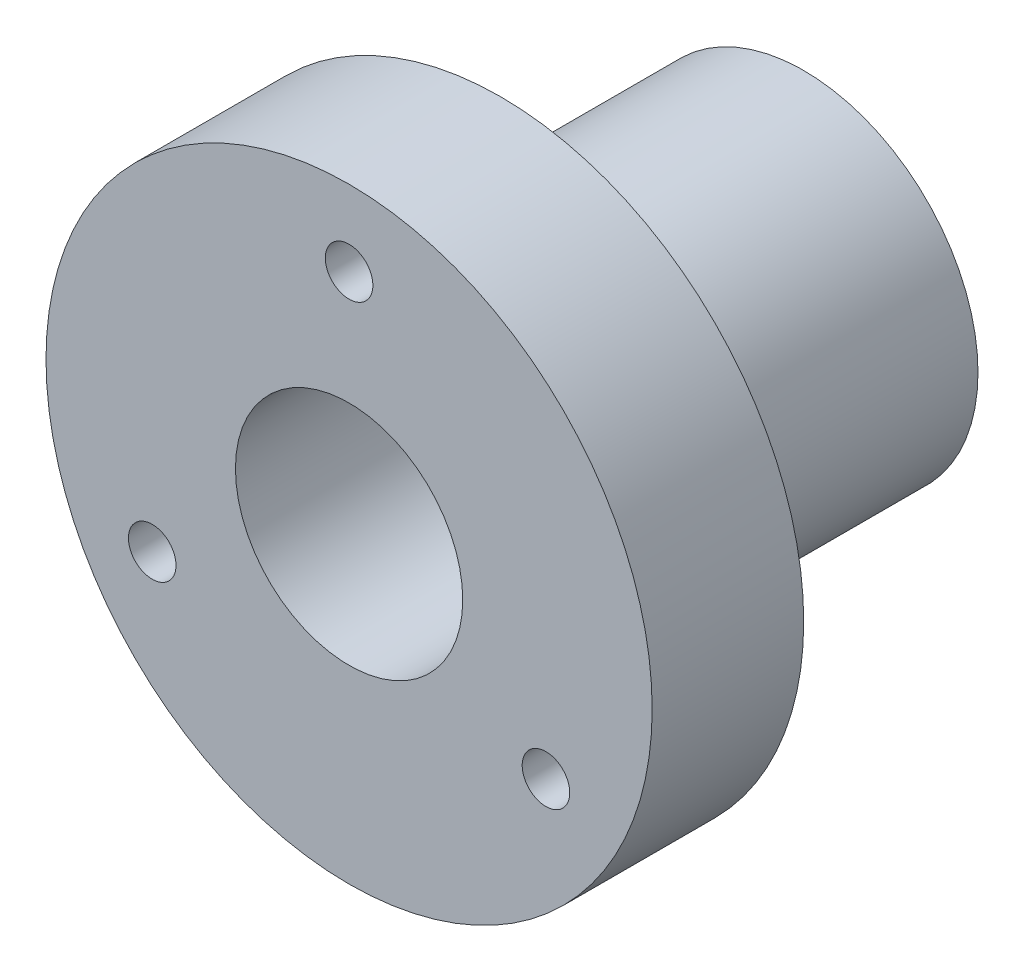
ISO-10303-21;
HEADER;
FILE_DESCRIPTION(('STEP AP214'),'2;1');
FILE_NAME('part.step','',(''),(''),'','','');
FILE_SCHEMA(('AUTOMOTIVE_DESIGN { 1 0 10303 214 1 1 1 1 }'));
ENDSEC;
DATA;
#1=APPLICATION_CONTEXT('core data for automotive mechanical design processes');
#2=APPLICATION_PROTOCOL_DEFINITION('international standard','automotive_design',2000,#1);
#3=PRODUCT_CONTEXT('',#1,'mechanical');
#4=PRODUCT('Part','Part','',(#3));
#5=PRODUCT_RELATED_PRODUCT_CATEGORY('part','',(#4));
#6=PRODUCT_DEFINITION_FORMATION('','',#4);
#7=PRODUCT_DEFINITION_CONTEXT('part definition',#1,'design');
#8=PRODUCT_DEFINITION('design','',#6,#7);
#9=PRODUCT_DEFINITION_SHAPE('','',#8);
#10=(LENGTH_UNIT() NAMED_UNIT(*) SI_UNIT(.MILLI.,.METRE.));
#11=(NAMED_UNIT(*) PLANE_ANGLE_UNIT() SI_UNIT($,.RADIAN.));
#12=(NAMED_UNIT(*) SI_UNIT($,.STERADIAN.) SOLID_ANGLE_UNIT());
#13=UNCERTAINTY_MEASURE_WITH_UNIT(LENGTH_MEASURE(1.E-05),#10,'distance_accuracy_value','');
#14=(GEOMETRIC_REPRESENTATION_CONTEXT(3) GLOBAL_UNCERTAINTY_ASSIGNED_CONTEXT((#13)) GLOBAL_UNIT_ASSIGNED_CONTEXT((#10,
#11,#12)) REPRESENTATION_CONTEXT('',''));
#15=CARTESIAN_POINT('',(0.,0.,0.));
#16=DIRECTION('',(0.,0.,1.));
#17=DIRECTION('',(1.,0.,0.));
#18=AXIS2_PLACEMENT_3D('',#15,#16,#17);
#19=CARTESIAN_POINT('',(0.,0.,-38.1));
#20=DIRECTION('',(0.,0.,1.));
#21=DIRECTION('',(1.,0.,0.));
#22=AXIS2_PLACEMENT_3D('',#19,#20,#21);
#23=PLANE('',#22);
#24=CARTESIAN_POINT('',(0.,0.,-38.1));
#25=DIRECTION('',(0.,0.,1.));
#26=DIRECTION('',(1.,0.,0.));
#27=AXIS2_PLACEMENT_3D('',#24,#25,#26);
#28=CIRCLE('',#27,14.605);
#29=CARTESIAN_POINT('',(14.605,0.,-38.1));
#30=VERTEX_POINT('',#29);
#31=EDGE_CURVE('E84',#30,#30,#28,.T.);
#32=ORIENTED_EDGE('',*,*,#31,.F.);
#33=EDGE_LOOP('',(#32));
#34=FACE_BOUND('',#33,.T.);
#35=CARTESIAN_POINT('',(0.,0.,-38.1));
#36=DIRECTION('',(0.,0.,-1.));
#37=DIRECTION('',(-1.,0.,0.));
#38=AXIS2_PLACEMENT_3D('',#35,#36,#37);
#39=CIRCLE('',#38,4.99999999999999);
#40=CARTESIAN_POINT('',(-4.99999999999999,0.,-38.1));
#41=VERTEX_POINT('',#40);
#42=EDGE_CURVE('E63',#41,#41,#39,.T.);
#43=ORIENTED_EDGE('',*,*,#42,.F.);
#44=EDGE_LOOP('',(#43));
#45=FACE_BOUND('',#44,.T.);
#46=ADVANCED_FACE('F36',(#34,#45),#23,.F.);
#47=CARTESIAN_POINT('',(0.,0.,-12.7));
#48=DIRECTION('',(0.,0.,1.));
#49=DIRECTION('',(1.,0.,0.));
#50=AXIS2_PLACEMENT_3D('',#47,#48,#49);
#51=CYLINDRICAL_SURFACE('',#50,25.4);
#52=CARTESIAN_POINT('',(0.,0.,-12.7));
#53=DIRECTION('',(0.,0.,1.));
#54=DIRECTION('',(1.,0.,0.));
#55=AXIS2_PLACEMENT_3D('',#52,#53,#54);
#56=CIRCLE('',#55,25.4);
#57=CARTESIAN_POINT('',(25.4,0.,-12.7));
#58=VERTEX_POINT('',#57);
#59=EDGE_CURVE('E10',#58,#58,#56,.T.);
#60=ORIENTED_EDGE('',*,*,#59,.T.);
#61=EDGE_LOOP('',(#60));
#62=FACE_BOUND('',#61,.T.);
#63=CARTESIAN_POINT('',(0.,0.,0.));
#64=DIRECTION('',(0.,0.,1.));
#65=DIRECTION('',(1.,0.,0.));
#66=AXIS2_PLACEMENT_3D('',#63,#64,#65);
#67=CIRCLE('',#66,25.4);
#68=CARTESIAN_POINT('',(25.4,0.,0.));
#69=VERTEX_POINT('',#68);
#70=EDGE_CURVE('E44',#69,#69,#67,.T.);
#71=ORIENTED_EDGE('',*,*,#70,.F.);
#72=EDGE_LOOP('',(#71));
#73=FACE_BOUND('',#72,.T.);
#74=ADVANCED_FACE('F38',(#62,#73),#51,.T.);
#75=CARTESIAN_POINT('',(0.,0.,-12.7));
#76=DIRECTION('',(0.,0.,1.));
#77=DIRECTION('',(1.,0.,0.));
#78=AXIS2_PLACEMENT_3D('',#75,#76,#77);
#79=PLANE('',#78);
#80=CARTESIAN_POINT('',(0.,19.05,-12.7));
#81=DIRECTION('',(0.,0.,-1.));
#82=DIRECTION('',(-1.,0.,0.));
#83=AXIS2_PLACEMENT_3D('',#80,#81,#82);
#84=CIRCLE('',#83,1.9939);
#85=CARTESIAN_POINT('',(-1.9939,19.05,-12.7));
#86=VERTEX_POINT('',#85);
#87=EDGE_CURVE('E55',#86,#86,#84,.T.);
#88=ORIENTED_EDGE('',*,*,#87,.F.);
#89=EDGE_LOOP('',(#88));
#90=FACE_BOUND('',#89,.T.);
#91=CARTESIAN_POINT('',(16.4977839420935,-9.52500000000008,-12.7));
#92=DIRECTION('',(0.,0.,-1.));
#93=DIRECTION('',(-1.,0.,0.));
#94=AXIS2_PLACEMENT_3D('',#91,#92,#93);
#95=CIRCLE('',#94,1.9939);
#96=CARTESIAN_POINT('',(14.5038839420935,-9.52500000000008,-12.7));
#97=VERTEX_POINT('',#96);
#98=EDGE_CURVE('E73',#97,#97,#95,.T.);
#99=ORIENTED_EDGE('',*,*,#98,.F.);
#100=EDGE_LOOP('',(#99));
#101=FACE_BOUND('',#100,.T.);
#102=CARTESIAN_POINT('',(-16.4977839420935,-9.52500000000008,-12.7));
#103=DIRECTION('',(0.,0.,-1.));
#104=DIRECTION('',(-1.,0.,0.));
#105=AXIS2_PLACEMENT_3D('',#102,#103,#104);
#106=CIRCLE('',#105,1.9939);
#107=CARTESIAN_POINT('',(-18.4916839420935,-9.52500000000008,-12.7));
#108=VERTEX_POINT('',#107);
#109=EDGE_CURVE('E79',#108,#108,#106,.T.);
#110=ORIENTED_EDGE('',*,*,#109,.F.);
#111=EDGE_LOOP('',(#110));
#112=FACE_BOUND('',#111,.T.);
#113=CARTESIAN_POINT('',(0.,0.,-12.7));
#114=DIRECTION('',(0.,0.,1.));
#115=DIRECTION('',(1.,0.,0.));
#116=AXIS2_PLACEMENT_3D('',#113,#114,#115);
#117=CIRCLE('',#116,14.605);
#118=CARTESIAN_POINT('',(14.605,0.,-12.7));
#119=VERTEX_POINT('',#118);
#120=EDGE_CURVE('E49',#119,#119,#117,.T.);
#121=ORIENTED_EDGE('',*,*,#120,.T.);
#122=EDGE_LOOP('',(#121));
#123=FACE_BOUND('',#122,.T.);
#124=ORIENTED_EDGE('',*,*,#59,.F.);
#125=EDGE_LOOP('',(#124));
#126=FACE_BOUND('',#125,.T.);
#127=ADVANCED_FACE('F91',(#90,#101,#112,#123,#126),#79,.F.);
#128=CARTESIAN_POINT('',(0.,0.,0.));
#129=DIRECTION('',(0.,0.,1.));
#130=DIRECTION('',(1.,0.,0.));
#131=AXIS2_PLACEMENT_3D('',#128,#129,#130);
#132=PLANE('',#131);
#133=CARTESIAN_POINT('',(0.,0.,0.));
#134=DIRECTION('',(0.,0.,1.));
#135=DIRECTION('',(1.,0.,0.));
#136=AXIS2_PLACEMENT_3D('',#133,#134,#135);
#137=CIRCLE('',#136,9.525);
#138=CARTESIAN_POINT('',(9.525,0.,0.));
#139=VERTEX_POINT('',#138);
#140=EDGE_CURVE('E149',#139,#139,#137,.T.);
#141=ORIENTED_EDGE('',*,*,#140,.F.);
#142=EDGE_LOOP('',(#141));
#143=FACE_BOUND('',#142,.T.);
#144=CARTESIAN_POINT('',(0.,19.05,0.));
#145=DIRECTION('',(0.,0.,-1.));
#146=DIRECTION('',(-1.,0.,0.));
#147=AXIS2_PLACEMENT_3D('',#144,#145,#146);
#148=CIRCLE('',#147,1.9939);
#149=CARTESIAN_POINT('',(-1.9939,19.05,0.));
#150=VERTEX_POINT('',#149);
#151=EDGE_CURVE('E60',#150,#150,#148,.T.);
#152=ORIENTED_EDGE('',*,*,#151,.T.);
#153=EDGE_LOOP('',(#152));
#154=FACE_BOUND('',#153,.T.);
#155=CARTESIAN_POINT('',(16.4977839420935,-9.52500000000008,0.));
#156=DIRECTION('',(0.,0.,-1.));
#157=DIRECTION('',(-1.,0.,0.));
#158=AXIS2_PLACEMENT_3D('',#155,#156,#157);
#159=CIRCLE('',#158,1.9939);
#160=CARTESIAN_POINT('',(14.5038839420935,-9.52500000000008,0.));
#161=VERTEX_POINT('',#160);
#162=EDGE_CURVE('E76',#161,#161,#159,.T.);
#163=ORIENTED_EDGE('',*,*,#162,.T.);
#164=EDGE_LOOP('',(#163));
#165=FACE_BOUND('',#164,.T.);
#166=CARTESIAN_POINT('',(-16.4977839420935,-9.52500000000008,0.));
#167=DIRECTION('',(0.,0.,-1.));
#168=DIRECTION('',(-1.,0.,0.));
#169=AXIS2_PLACEMENT_3D('',#166,#167,#168);
#170=CIRCLE('',#169,1.9939);
#171=CARTESIAN_POINT('',(-18.4916839420935,-9.52500000000008,0.));
#172=VERTEX_POINT('',#171);
#173=EDGE_CURVE('E82',#172,#172,#170,.T.);
#174=ORIENTED_EDGE('',*,*,#173,.T.);
#175=EDGE_LOOP('',(#174));
#176=FACE_BOUND('',#175,.T.);
#177=ORIENTED_EDGE('',*,*,#70,.T.);
#178=EDGE_LOOP('',(#177));
#179=FACE_BOUND('',#178,.T.);
#180=ADVANCED_FACE('F97',(#143,#154,#165,#176,#179),#132,.T.);
#181=CARTESIAN_POINT('',(0.,0.,-38.1));
#182=DIRECTION('',(0.,0.,1.));
#183=DIRECTION('',(1.,0.,0.));
#184=AXIS2_PLACEMENT_3D('',#181,#182,#183);
#185=CYLINDRICAL_SURFACE('',#184,14.605);
#186=CARTESIAN_POINT('',(14.605,0.,-38.1));
#187=CARTESIAN_POINT('',(14.605,0.,-37.8354166666667));
#188=CARTESIAN_POINT('',(14.605,0.,-37.5708333333333));
#189=CARTESIAN_POINT('',(14.605,0.,-37.0416666666667));
#190=CARTESIAN_POINT('',(14.605,0.,-36.7770833333333));
#191=CARTESIAN_POINT('',(14.605,0.,-36.2479166666667));
#192=CARTESIAN_POINT('',(14.605,0.,-35.9833333333333));
#193=CARTESIAN_POINT('',(14.605,0.,-35.4541666666667));
#194=CARTESIAN_POINT('',(14.605,0.,-35.1895833333333));
#195=CARTESIAN_POINT('',(14.605,0.,-34.6604166666667));
#196=CARTESIAN_POINT('',(14.605,0.,-34.3958333333333));
#197=CARTESIAN_POINT('',(14.605,0.,-33.8666666666667));
#198=CARTESIAN_POINT('',(14.605,0.,-33.6020833333333));
#199=CARTESIAN_POINT('',(14.605,0.,-33.0729166666667));
#200=CARTESIAN_POINT('',(14.605,0.,-32.8083333333333));
#201=CARTESIAN_POINT('',(14.605,0.,-32.2791666666667));
#202=CARTESIAN_POINT('',(14.605,0.,-32.0145833333333));
#203=CARTESIAN_POINT('',(14.605,0.,-31.4854166666667));
#204=CARTESIAN_POINT('',(14.605,0.,-31.2208333333333));
#205=CARTESIAN_POINT('',(14.605,0.,-30.6916666666667));
#206=CARTESIAN_POINT('',(14.605,0.,-30.4270833333333));
#207=CARTESIAN_POINT('',(14.605,0.,-29.8979166666667));
#208=CARTESIAN_POINT('',(14.605,0.,-29.6333333333333));
#209=CARTESIAN_POINT('',(14.605,0.,-29.1041666666667));
#210=CARTESIAN_POINT('',(14.605,0.,-28.8395833333333));
#211=CARTESIAN_POINT('',(14.605,0.,-28.3104166666667));
#212=CARTESIAN_POINT('',(14.605,0.,-28.0458333333333));
#213=CARTESIAN_POINT('',(14.605,0.,-27.5166666666667));
#214=CARTESIAN_POINT('',(14.605,0.,-27.2520833333333));
#215=CARTESIAN_POINT('',(14.605,0.,-26.7229166666667));
#216=CARTESIAN_POINT('',(14.605,0.,-26.4583333333333));
#217=CARTESIAN_POINT('',(14.605,0.,-25.9291666666667));
#218=CARTESIAN_POINT('',(14.605,0.,-25.6645833333333));
#219=CARTESIAN_POINT('',(14.605,0.,-25.1354166666667));
#220=CARTESIAN_POINT('',(14.605,0.,-24.8708333333333));
#221=CARTESIAN_POINT('',(14.605,0.,-24.3416666666667));
#222=CARTESIAN_POINT('',(14.605,0.,-24.0770833333333));
#223=CARTESIAN_POINT('',(14.605,0.,-23.5479166666667));
#224=CARTESIAN_POINT('',(14.605,0.,-23.2833333333333));
#225=CARTESIAN_POINT('',(14.605,0.,-22.7541666666667));
#226=CARTESIAN_POINT('',(14.605,0.,-22.4895833333333));
#227=CARTESIAN_POINT('',(14.605,0.,-21.9604166666667));
#228=CARTESIAN_POINT('',(14.605,0.,-21.6958333333333));
#229=CARTESIAN_POINT('',(14.605,0.,-21.1666666666667));
#230=CARTESIAN_POINT('',(14.605,0.,-20.9020833333333));
#231=CARTESIAN_POINT('',(14.605,0.,-20.3729166666667));
#232=CARTESIAN_POINT('',(14.605,0.,-20.1083333333333));
#233=CARTESIAN_POINT('',(14.605,0.,-19.5791666666667));
#234=CARTESIAN_POINT('',(14.605,0.,-19.3145833333333));
#235=CARTESIAN_POINT('',(14.605,0.,-18.7854166666667));
#236=CARTESIAN_POINT('',(14.605,0.,-18.5208333333333));
#237=CARTESIAN_POINT('',(14.605,0.,-17.9916666666667));
#238=CARTESIAN_POINT('',(14.605,0.,-17.7270833333333));
#239=CARTESIAN_POINT('',(14.605,0.,-17.1979166666667));
#240=CARTESIAN_POINT('',(14.605,0.,-16.9333333333333));
#241=CARTESIAN_POINT('',(14.605,0.,-16.4041666666667));
#242=CARTESIAN_POINT('',(14.605,0.,-16.1395833333333));
#243=CARTESIAN_POINT('',(14.605,0.,-15.6104166666667));
#244=CARTESIAN_POINT('',(14.605,0.,-15.3458333333333));
#245=CARTESIAN_POINT('',(14.605,0.,-14.8166666666667));
#246=CARTESIAN_POINT('',(14.605,0.,-14.5520833333333));
#247=CARTESIAN_POINT('',(14.605,0.,-14.0229166666667));
#248=CARTESIAN_POINT('',(14.605,0.,-13.7583333333333));
#249=CARTESIAN_POINT('',(14.605,0.,-13.2291666666667));
#250=CARTESIAN_POINT('',(14.605,0.,-12.9645833333333));
#251=CARTESIAN_POINT('',(14.605,0.,-12.7));
#252=B_SPLINE_CURVE_WITH_KNOTS('',3,(#186,#187,#188,#189,#190,#191,#192,#193,#194,#195,#196,
#197,#198,#199,#200,#201,#202,#203,#204,#205,#206,#207,#208,#209,#210,#211,#212,#213,#214,#215,
#216,#217,#218,#219,#220,#221,#222,#223,#224,#225,#226,#227,#228,#229,#230,#231,#232,#233,#234,
#235,#236,#237,#238,#239,#240,#241,#242,#243,#244,#245,#246,#247,#248,#249,#250,#251),
.UNSPECIFIED.,.F.,.F.,(4,2,2,2,2,2,2,2,2,2,2,2,2,2,2,2,2,2,2,2,2,2,2,2,2,2,2,2,2,2,2,2,4),(0.,
0.793750000000003,1.58750000000001,2.38125,3.175,3.96875000000001,4.7625,5.55625000000001,
6.35000000000001,7.14375,7.93750000000001,8.73125,9.52500000000001,10.31875,11.1125,11.90625,
12.7,13.49375,14.2875,15.08125,15.875,16.66875,17.4625,18.25625,19.05,19.84375,20.6375,21.43125,
22.225,23.01875,23.8125,24.60625,25.4),.UNSPECIFIED.);
#253=EDGE_CURVE('BSEAM94',#30,#119,#252,.T.);
#254=ORIENTED_EDGE('',*,*,#31,.T.);
#255=ORIENTED_EDGE('',*,*,#120,.F.);
#256=ORIENTED_EDGE('',*,*,#253,.T.);
#257=ORIENTED_EDGE('',*,*,#253,.F.);
#258=EDGE_LOOP('',(#254,#256,#255,#257));
#259=FACE_BOUND('',#258,.T.);
#260=ADVANCED_FACE('F94',(#259),#185,.T.);
#261=CARTESIAN_POINT('',(-16.4977839420935,-9.52500000000008,-12.7));
#262=DIRECTION('',(0.,0.,-1.));
#263=DIRECTION('',(-1.,0.,0.));
#264=AXIS2_PLACEMENT_3D('',#261,#262,#263);
#265=CYLINDRICAL_SURFACE('',#264,1.9939);
#266=ORIENTED_EDGE('',*,*,#173,.F.);
#267=EDGE_LOOP('',(#266));
#268=FACE_BOUND('',#267,.T.);
#269=ORIENTED_EDGE('',*,*,#109,.T.);
#270=EDGE_LOOP('',(#269));
#271=FACE_BOUND('',#270,.T.);
#272=ADVANCED_FACE('F96',(#268,#271),#265,.F.);
#273=CARTESIAN_POINT('',(16.4977839420935,-9.52500000000008,-12.7));
#274=DIRECTION('',(0.,0.,-1.));
#275=DIRECTION('',(-1.,0.,0.));
#276=AXIS2_PLACEMENT_3D('',#273,#274,#275);
#277=CYLINDRICAL_SURFACE('',#276,1.9939);
#278=ORIENTED_EDGE('',*,*,#162,.F.);
#279=EDGE_LOOP('',(#278));
#280=FACE_BOUND('',#279,.T.);
#281=ORIENTED_EDGE('',*,*,#98,.T.);
#282=EDGE_LOOP('',(#281));
#283=FACE_BOUND('',#282,.T.);
#284=ADVANCED_FACE('F103',(#280,#283),#277,.F.);
#285=CARTESIAN_POINT('',(0.,19.05,-12.7));
#286=DIRECTION('',(0.,0.,-1.));
#287=DIRECTION('',(-1.,0.,0.));
#288=AXIS2_PLACEMENT_3D('',#285,#286,#287);
#289=CYLINDRICAL_SURFACE('',#288,1.9939);
#290=ORIENTED_EDGE('',*,*,#151,.F.);
#291=EDGE_LOOP('',(#290));
#292=FACE_BOUND('',#291,.T.);
#293=ORIENTED_EDGE('',*,*,#87,.T.);
#294=EDGE_LOOP('',(#293));
#295=FACE_BOUND('',#294,.T.);
#296=ADVANCED_FACE('F118',(#292,#295),#289,.F.);
#297=CARTESIAN_POINT('',(0.,0.,-38.1));
#298=DIRECTION('',(0.,0.,-1.));
#299=DIRECTION('',(-1.,0.,0.));
#300=AXIS2_PLACEMENT_3D('',#297,#298,#299);
#301=CYLINDRICAL_SURFACE('',#300,4.2);
#302=CARTESIAN_POINT('',(0.,0.,-26.0595827963218));
#303=DIRECTION('',(0.,0.,1.));
#304=DIRECTION('',(1.,0.,0.));
#305=AXIS2_PLACEMENT_3D('',#302,#303,#304);
#306=CIRCLE('',#305,4.2);
#307=CARTESIAN_POINT('',(4.2,0.,-26.0595827963218));
#308=VERTEX_POINT('',#307);
#309=EDGE_CURVE('E40',#308,#308,#306,.T.);
#310=ORIENTED_EDGE('',*,*,#309,.T.);
#311=EDGE_LOOP('',(#310));
#312=FACE_BOUND('',#311,.T.);
#313=CARTESIAN_POINT('',(0.,0.,-27.459311504778));
#314=DIRECTION('',(0.,0.,-1.));
#315=DIRECTION('',(-1.,0.,0.));
#316=AXIS2_PLACEMENT_3D('',#313,#314,#315);
#317=CIRCLE('',#316,4.2);
#318=CARTESIAN_POINT('',(-4.2,0.,-27.459311504778));
#319=VERTEX_POINT('',#318);
#320=EDGE_CURVE('E53',#319,#319,#317,.T.);
#321=ORIENTED_EDGE('',*,*,#320,.T.);
#322=EDGE_LOOP('',(#321));
#323=FACE_BOUND('',#322,.T.);
#324=ADVANCED_FACE('F122',(#312,#323),#301,.F.);
#325=CARTESIAN_POINT('',(0.,0.,-27.94));
#326=DIRECTION('',(0.,0.,-1.));
#327=DIRECTION('',(-1.,0.,0.));
#328=AXIS2_PLACEMENT_3D('',#325,#326,#327);
#329=CONICAL_SURFACE('',#328,5.,1.02974425867665);
#330=CARTESIAN_POINT('',(0.,0.,-27.94));
#331=DIRECTION('',(0.,0.,-1.));
#332=DIRECTION('',(-1.,0.,0.));
#333=AXIS2_PLACEMENT_3D('',#330,#331,#332);
#334=CIRCLE('',#333,5.);
#335=CARTESIAN_POINT('',(-5.,0.,-27.94));
#336=VERTEX_POINT('',#335);
#337=EDGE_CURVE('E56',#336,#336,#334,.T.);
#338=ORIENTED_EDGE('',*,*,#337,.T.);
#339=EDGE_LOOP('',(#338));
#340=FACE_BOUND('',#339,.T.);
#341=ORIENTED_EDGE('',*,*,#320,.F.);
#342=EDGE_LOOP('',(#341));
#343=FACE_BOUND('',#342,.T.);
#344=ADVANCED_FACE('F126',(#340,#343),#329,.F.);
#345=CARTESIAN_POINT('',(0.,0.,-38.1));
#346=DIRECTION('',(0.,0.,-1.));
#347=DIRECTION('',(-1.,0.,0.));
#348=AXIS2_PLACEMENT_3D('',#345,#346,#347);
#349=CYLINDRICAL_SURFACE('',#348,4.99999999999999);
#350=ORIENTED_EDGE('',*,*,#337,.F.);
#351=EDGE_LOOP('',(#350));
#352=FACE_BOUND('',#351,.T.);
#353=ORIENTED_EDGE('',*,*,#42,.T.);
#354=EDGE_LOOP('',(#353));
#355=FACE_BOUND('',#354,.T.);
#356=ADVANCED_FACE('F130',(#352,#355),#349,.F.);
#357=CARTESIAN_POINT('',(0.,0.,-22.86));
#358=DIRECTION('',(0.,0.,1.));
#359=DIRECTION('',(1.,0.,0.));
#360=AXIS2_PLACEMENT_3D('',#357,#358,#359);
#361=CONICAL_SURFACE('',#360,9.52499999999999,1.02974425867665);
#362=CARTESIAN_POINT('',(0.,0.,-22.86));
#363=DIRECTION('',(0.,0.,1.));
#364=DIRECTION('',(1.,0.,0.));
#365=AXIS2_PLACEMENT_3D('',#362,#363,#364);
#366=CIRCLE('',#365,9.52499999999999);
#367=CARTESIAN_POINT('',(9.52499999999999,0.,-22.86));
#368=VERTEX_POINT('',#367);
#369=EDGE_CURVE('E146',#368,#368,#366,.T.);
#370=ORIENTED_EDGE('',*,*,#369,.T.);
#371=EDGE_LOOP('',(#370));
#372=FACE_BOUND('',#371,.T.);
#373=ORIENTED_EDGE('',*,*,#309,.F.);
#374=EDGE_LOOP('',(#373));
#375=FACE_BOUND('',#374,.T.);
#376=ADVANCED_FACE('F133',(#372,#375),#361,.F.);
#377=CARTESIAN_POINT('',(0.,0.,0.));
#378=DIRECTION('',(0.,0.,1.));
#379=DIRECTION('',(1.,0.,0.));
#380=AXIS2_PLACEMENT_3D('',#377,#378,#379);
#381=CYLINDRICAL_SURFACE('',#380,9.52499999999999);
#382=ORIENTED_EDGE('',*,*,#369,.F.);
#383=EDGE_LOOP('',(#382));
#384=FACE_BOUND('',#383,.T.);
#385=ORIENTED_EDGE('',*,*,#140,.T.);
#386=EDGE_LOOP('',(#385));
#387=FACE_BOUND('',#386,.T.);
#388=ADVANCED_FACE('F137',(#384,#387),#381,.F.);
#389=CLOSED_SHELL('',(#46,#74,#127,#180,#260,#272,#284,#296,#324,#344,#356,#376,#388));
#390=MANIFOLD_SOLID_BREP('B2',#389);
#391=ADVANCED_BREP_SHAPE_REPRESENTATION('',(#18,#390),#14);
#392=SHAPE_DEFINITION_REPRESENTATION(#9,#391);
ENDSEC;
END-ISO-10303-21;
